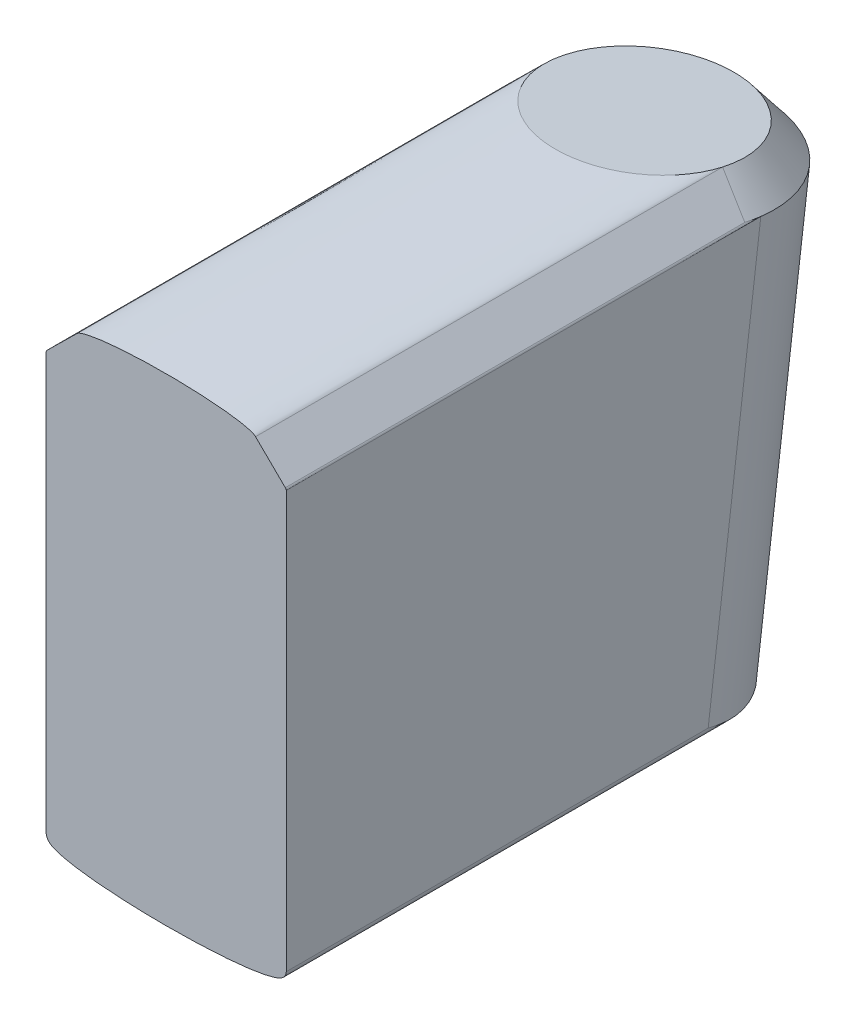
ISO-10303-21;
HEADER;
FILE_DESCRIPTION(('STEP AP214'),'2;1');
FILE_NAME('part.step','',(''),(''),'','','');
FILE_SCHEMA(('AUTOMOTIVE_DESIGN { 1 0 10303 214 1 1 1 1 }'));
ENDSEC;
DATA;
#1=APPLICATION_CONTEXT('core data for automotive mechanical design processes');
#2=APPLICATION_PROTOCOL_DEFINITION('international standard','automotive_design',2000,#1);
#3=PRODUCT_CONTEXT('',#1,'mechanical');
#4=PRODUCT('Part','Part','',(#3));
#5=PRODUCT_RELATED_PRODUCT_CATEGORY('part','',(#4));
#6=PRODUCT_DEFINITION_FORMATION('','',#4);
#7=PRODUCT_DEFINITION_CONTEXT('part definition',#1,'design');
#8=PRODUCT_DEFINITION('design','',#6,#7);
#9=PRODUCT_DEFINITION_SHAPE('','',#8);
#10=(LENGTH_UNIT() NAMED_UNIT(*) SI_UNIT(.MILLI.,.METRE.));
#11=(NAMED_UNIT(*) PLANE_ANGLE_UNIT() SI_UNIT($,.RADIAN.));
#12=(NAMED_UNIT(*) SI_UNIT($,.STERADIAN.) SOLID_ANGLE_UNIT());
#13=UNCERTAINTY_MEASURE_WITH_UNIT(LENGTH_MEASURE(1.E-05),#10,'distance_accuracy_value','');
#14=(GEOMETRIC_REPRESENTATION_CONTEXT(3) GLOBAL_UNCERTAINTY_ASSIGNED_CONTEXT((#13)) GLOBAL_UNIT_ASSIGNED_CONTEXT((#10,
#11,#12)) REPRESENTATION_CONTEXT('',''));
#15=CARTESIAN_POINT('',(0.,0.,0.));
#16=DIRECTION('',(0.,0.,1.));
#17=DIRECTION('',(1.,0.,0.));
#18=AXIS2_PLACEMENT_3D('',#15,#16,#17);
#19=CARTESIAN_POINT('',(0.,14.9408602598586,-0.939999251732284));
#20=DIRECTION('',(0.,-0.992114701314478,0.125333233564305));
#21=DIRECTION('',(0.,-0.125333233564305,-0.992114701314478));
#22=AXIS2_PLACEMENT_3D('',#19,#20,#21);
#23=CYLINDRICAL_SURFACE('',#22,4.);
#24=CARTESIAN_POINT('',(-4.,0.0591397401414062,0.939999251732286));
#25=CARTESIAN_POINT('',(-4.00000000000825,0.0591397430999098,0.939860596242548));
#26=CARTESIAN_POINT('',(-3.99999999259306,0.0591375188139687,0.939721942757717));
#27=CARTESIAN_POINT('',(-3.99999996306076,0.0591286613641135,0.939444194987688));
#28=CARTESIAN_POINT('',(-3.9999999408822,0.0591220097729296,0.93930510128862));
#29=CARTESIAN_POINT('',(-3.99999988181898,0.0591042986346159,0.939026473673091));
#30=CARTESIAN_POINT('',(-3.99999984485888,0.0590932164763934,0.938886941198471));
#31=CARTESIAN_POINT('',(-3.99999975620273,0.059066649380006,0.938607434794075));
#32=CARTESIAN_POINT('',(-3.99999970441786,0.0590511379039939,0.938467463391048));
#33=CARTESIAN_POINT('',(-3.99999958599731,0.0590157159310171,0.938187078138462));
#34=CARTESIAN_POINT('',(-3.99999951925964,0.0589957752362977,0.938046668110344));
#35=CARTESIAN_POINT('',(-3.99999937066474,0.0589514987839774,0.937765404075305));
#36=CARTESIAN_POINT('',(-3.99999928869196,0.0589271294749136,0.937624555356597));
#37=CARTESIAN_POINT('',(-3.99999910915338,0.0588739989587133,0.937342413131157));
#38=CARTESIAN_POINT('',(-3.99999901145735,0.0588452011670434,0.937201126527064));
#39=CARTESIAN_POINT('',(-3.99999879956971,0.0587832182387638,0.936918104330593));
#40=CARTESIAN_POINT('',(-3.99999868522952,0.0587499938390175,0.936776377330454));
#41=CARTESIAN_POINT('',(-3.99999856278132,0.0587147560962942,0.936635156614026));
#42=B_SPLINE_CURVE_WITH_KNOTS('',3,(#24,#25,#26,#27,#28,#29,#30,#31,#32,#33,#34,#35,#36,#37,#38,
#39,#40,#41),.UNSPECIFIED.,.F.,.F.,(4,2,2,2,2,2,2,2,4),(0.,0.000415945651314462,
0.000833633463143243,0.00125348069692003,0.00167589817400402,0.00210128920952744,
0.00253004865096333,0.00296256202986252,0.00339920483208718),.UNSPECIFIED.);
#43=CARTESIAN_POINT('',(-4.,0.0591397401414063,0.939999251732215));
#44=VERTEX_POINT('',#43);
#45=CARTESIAN_POINT('',(-3.99999856278132,0.0587147560960978,0.936635156614074));
#46=VERTEX_POINT('',#45);
#47=EDGE_CURVE('E146',#44,#46,#42,.T.);
#48=ORIENTED_EDGE('',*,*,#47,.F.);
#49=DIRECTION('',(0.,-0.992114701314478,0.125333233564305));
#50=VECTOR('',#49,1.);
#51=CARTESIAN_POINT('',(-4.,14.9408602598586,-0.939999251732284));
#52=LINE('',#51,#50);
#53=CARTESIAN_POINT('',(-4.,13.9487455585441,-0.814666018167979));
#54=VERTEX_POINT('',#53);
#55=EDGE_CURVE('E202',#44,#54,#52,.F.);
#56=ORIENTED_EDGE('',*,*,#55,.T.);
#57=CARTESIAN_POINT('',(0.,13.9487455585441,-0.814666018167979));
#58=DIRECTION('',(0.,0.992114701314478,-0.125333233564305));
#59=DIRECTION('',(0.,0.125333233564305,0.992114701314478));
#60=AXIS2_PLACEMENT_3D('',#57,#58,#59);
#61=CIRCLE('',#60,4.);
#62=CARTESIAN_POINT('',(4.,13.9487455585441,-0.814666018167979));
#63=VERTEX_POINT('',#62);
#64=EDGE_CURVE('E197',#54,#63,#61,.F.);
#65=ORIENTED_EDGE('',*,*,#64,.T.);
#66=DIRECTION('',(0.,-0.992114701314478,0.125333233564305));
#67=VECTOR('',#66,1.);
#68=CARTESIAN_POINT('',(4.,14.9408602598586,-0.939999251732284));
#69=LINE('',#68,#67);
#70=CARTESIAN_POINT('',(4.,0.0591397401414146,0.939999251732282));
#71=VERTEX_POINT('',#70);
#72=EDGE_CURVE('E256',#71,#63,#69,.F.);
#73=ORIENTED_EDGE('',*,*,#72,.F.);
#74=CARTESIAN_POINT('',(4.,0.0591397401414106,0.939999251732282));
#75=CARTESIAN_POINT('',(4.00000000052614,0.0574493710376827,0.933532475212381));
#76=CARTESIAN_POINT('',(3.99998352812304,0.0557599311507043,0.92706545876494));
#77=CARTESIAN_POINT('',(3.99982307097168,0.0475360087144437,0.895568575544385));
#78=CARTESIAN_POINT('',(3.99944879814329,0.0410133538635032,0.870536669655964));
#79=CARTESIAN_POINT('',(3.99758475570664,0.0214606857048467,0.79541898529505));
#80=CARTESIAN_POINT('',(3.99535329695771,0.00845427829959971,0.745343027018158));
#81=CARTESIAN_POINT('',(3.98891215633778,-0.0172698465098414,0.64522247054523));
#82=CARTESIAN_POINT('',(3.98470150043677,-0.0299874185342031,0.595177899952373));
#83=CARTESIAN_POINT('',(3.96893799476104,-0.0678653718903086,0.443634854323599));
#84=CARTESIAN_POINT('',(3.95429063994798,-0.0923408037096869,0.342264820651646));
#85=CARTESIAN_POINT('',(3.91684316374045,-0.138376779583303,0.140332389196036));
#86=CARTESIAN_POINT('',(3.89403958114724,-0.159936080779346,0.0397703528488622));
#87=CARTESIAN_POINT('',(3.8403309363762,-0.200046754655376,-0.159987646271619));
#88=CARTESIAN_POINT('',(3.80941078108406,-0.218592418221974,-0.259180697813031));
#89=CARTESIAN_POINT('',(3.73968462505683,-0.253360812371097,-0.45516141401432));
#90=CARTESIAN_POINT('',(3.70087883243313,-0.269583604237726,-0.55194914207792));
#91=CARTESIAN_POINT('',(3.61570797361971,-0.300364862811318,-0.742183997419191));
#92=CARTESIAN_POINT('',(3.56935795522298,-0.314926546405096,-0.83563733213761));
#93=CARTESIAN_POINT('',(3.46935883887931,-0.342793907712976,-1.01871802641852));
#94=CARTESIAN_POINT('',(3.41570987002849,-0.356099607634539,-1.10834545361279));
#95=CARTESIAN_POINT('',(3.24432522095679,-0.394431029410317,-1.37051950329388));
#96=CARTESIAN_POINT('',(3.11605684242431,-0.417903821940581,-1.53656973509146));
#97=CARTESIAN_POINT('',(2.82548410407335,-0.462555961308566,-1.85691803837732));
#98=CARTESIAN_POINT('',(2.66149130747752,-0.4834814412168,-2.00971557857123));
#99=CARTESIAN_POINT('',(2.30990712613313,-0.521025127838156,-2.28605175801779));
#100=CARTESIAN_POINT('',(2.12230615944858,-0.537641577199958,-2.40957845798226));
#101=CARTESIAN_POINT('',(1.72840767699828,-0.566366924401856,-2.62402071408217));
#102=CARTESIAN_POINT('',(1.52206398680873,-0.578464292896345,-2.7148528366799));
#103=CARTESIAN_POINT('',(1.09701031418649,-0.597860130993364,-2.86081214082672));
#104=CARTESIAN_POINT('',(0.878312847617423,-0.605163366183399,-2.91597477865474));
#105=CARTESIAN_POINT('',(0.54812878871375,-0.612380042057467,-2.97047358549793));
#106=CARTESIAN_POINT('',(0.438841768812338,-0.614162709575954,-2.98393347446619));
#107=CARTESIAN_POINT('',(0.219719718192596,-0.616536592236411,-3.00186780505245));
#108=CARTESIAN_POINT('',(0.109886042408707,-0.617129964341594,-3.00635851355444));
#109=CARTESIAN_POINT('',(7.50625114059792E-08,-0.617126991384775,-3.00636027564742));
#110=B_SPLINE_CURVE_WITH_KNOTS('',3,(#74,#75,#76,#77,#78,#79,#80,#81,#82,#83,#84,#85,#86,#87,
#88,#89,#90,#91,#92,#93,#94,#95,#96,#97,#98,#99,#100,#101,#102,#103,#104,#105,#106,#107,#108,
#109),.UNSPECIFIED.,.F.,.F.,(4,2,2,2,2,2,2,2,2,2,2,2,2,2,2,2,2,4),(0.,0.0200521374118743,
0.0976594987804293,0.252972733016871,0.408362482316098,0.723904953868143,1.03958148905357,
1.3558492486217,1.67210866258932,1.98774482314006,2.30337540177793,2.93394106455434,
3.60615352938385,4.27863971290818,4.95283005158742,5.62634919532298,5.95640899764163,
6.28586964402648),.UNSPECIFIED.);
#111=CARTESIAN_POINT('',(7.50625114059792E-08,-0.617126991384775,-3.00636027564742));
#112=VERTEX_POINT('',#111);
#113=EDGE_CURVE('E13',#71,#112,#110,.T.);
#114=ORIENTED_EDGE('',*,*,#113,.T.);
#115=CARTESIAN_POINT('',(7.50625121954951E-08,-0.617126991384775,-3.00636027564742));
#116=CARTESIAN_POINT('',(-0.112502354536988,-0.617127458304091,-3.00637241386565));
#117=CARTESIAN_POINT('',(-0.225003049181203,-0.616504148588256,-3.00165545295331));
#118=CARTESIAN_POINT('',(-0.449199520423445,-0.614017643155655,-2.98285044301219));
#119=CARTESIAN_POINT('',(-0.560895335378356,-0.612154506923655,-2.96876284357072));
#120=CARTESIAN_POINT('',(-0.782606685801108,-0.60719791146088,-2.93131798335424));
#121=CARTESIAN_POINT('',(-0.892623441636566,-0.604105394779809,-2.9079678240905));
#122=CARTESIAN_POINT('',(-1.11028152225831,-0.596706901118178,-2.85216843221766));
#123=CARTESIAN_POINT('',(-1.21792287601136,-0.592400938943772,-2.81971931063182));
#124=CARTESIAN_POINT('',(-1.43010129844194,-0.582594622287905,-2.74594063662903));
#125=CARTESIAN_POINT('',(-1.53463734602909,-0.577093879772899,-2.70460819918829));
#126=CARTESIAN_POINT('',(-1.73986126032217,-0.564922383916615,-2.61334905634981));
#127=CARTESIAN_POINT('',(-1.84054777521986,-0.558251224083215,-2.56341936519262));
#128=CARTESIAN_POINT('',(-2.03728222935225,-0.543771435644091,-2.45535281811393));
#129=CARTESIAN_POINT('',(-2.13333183633733,-0.535963220121712,-2.39721894294349));
#130=CARTESIAN_POINT('',(-2.32014870037699,-0.519236467791686,-2.27314717210535));
#131=CARTESIAN_POINT('',(-2.41091595825543,-0.510317931157211,-2.20720927765482));
#132=CARTESIAN_POINT('',(-2.58653153421978,-0.491395114442221,-2.06799634126872));
#133=CARTESIAN_POINT('',(-2.67137926527588,-0.48139072693036,-1.99472057339805));
#134=CARTESIAN_POINT('',(-2.83451404379775,-0.46031669694135,-1.84139256196989));
#135=CARTESIAN_POINT('',(-2.91280336286419,-0.449247426179705,-1.76134268419586));
#136=CARTESIAN_POINT('',(-3.0623476742428,-0.426028582227096,-1.59496920332066));
#137=CARTESIAN_POINT('',(-3.1335979336879,-0.413878292482405,-1.50864144595305));
#138=CARTESIAN_POINT('',(-3.26847166235237,-0.38846451870279,-1.33042602536174));
#139=CARTESIAN_POINT('',(-3.33209799400053,-0.375201455662294,-1.23854046845381));
#140=CARTESIAN_POINT('',(-3.45132582668123,-0.347431297080968,-1.04982715631966));
#141=CARTESIAN_POINT('',(-3.50692403397388,-0.332923694805877,-0.952997394538184));
#142=CARTESIAN_POINT('',(-3.609671719606,-0.302391853373769,-0.755168748280597));
#143=CARTESIAN_POINT('',(-3.65682034213388,-0.286367460840381,-0.654169442767733));
#144=CARTESIAN_POINT('',(-3.74228644246645,-0.252261389982194,-0.448932633719922));
#145=CARTESIAN_POINT('',(-3.78061097880755,-0.234181373402697,-0.344697794623607));
#146=CARTESIAN_POINT('',(-3.8481866715296,-0.194995351800946,-0.133906727588307));
#147=CARTESIAN_POINT('',(-3.87744120413931,-0.173890477043581,-0.0273513792841332));
#148=CARTESIAN_POINT('',(-3.91832013959133,-0.135910525811473,0.150611785797295));
#149=CARTESIAN_POINT('',(-3.93255659333683,-0.120038690070211,0.221645887068277));
#150=CARTESIAN_POINT('',(-3.95698309840348,-0.0869380588945589,0.364086536963375));
#151=CARTESIAN_POINT('',(-3.9671735322376,-0.0697093919203863,0.435493049732522));
#152=CARTESIAN_POINT('',(-3.98349718725059,-0.0342741787038903,0.578496394511027));
#153=CARTESIAN_POINT('',(-3.9896321919075,-0.0160680661319472,0.650093128938276));
#154=CARTESIAN_POINT('',(-3.99476949720659,0.00701171356078451,0.73963714727031));
#155=CARTESIAN_POINT('',(-3.99567044362449,0.0116441673399262,0.757549859073001));
#156=CARTESIAN_POINT('',(-3.99721930246681,0.0209264516168187,0.793381688218235));
#157=CARTESIAN_POINT('',(-3.99786722223262,0.0255762816064585,0.81130080535983));
#158=CARTESIAN_POINT('',(-3.99864924142953,0.0325838136359734,0.838176156207326));
#159=CARTESIAN_POINT('',(-3.99887827137278,0.0349251271860422,0.847134071463539));
#160=CARTESIAN_POINT('',(-3.99927309092776,0.0396112581828137,0.865050419676502));
#161=CARTESIAN_POINT('',(-3.99943888088453,0.0419560756103295,0.87400885263016));
#162=CARTESIAN_POINT('',(-3.99964015518001,0.0454643659957547,0.887449775457109));
#163=CARTESIAN_POINT('',(-3.99969934641032,0.0466323583733035,0.891930827206091));
#164=CARTESIAN_POINT('',(-3.99980192596806,0.0489535346755005,0.900897121663002));
#165=CARTESIAN_POINT('',(-3.99984531478178,0.050106719054779,0.905382364237708));
#166=CARTESIAN_POINT('',(-3.99991627144571,0.0524016641198939,0.914355455472441));
#167=CARTESIAN_POINT('',(-3.99994383673803,0.0535434229294714,0.918843304436489));
#168=CARTESIAN_POINT('',(-3.99997328166083,0.0552927803530263,0.925569236991057));
#169=CARTESIAN_POINT('',(-3.99998111284772,0.0558820350662995,0.927810298872267));
#170=CARTESIAN_POINT('',(-3.99998985772567,0.0569109350774877,0.931128533239139));
#171=CARTESIAN_POINT('',(-3.99999227258075,0.0572781739883659,0.932227636248346));
#172=CARTESIAN_POINT('',(-3.99999516899759,0.0578482094812609,0.933870095718069));
#173=CARTESIAN_POINT('',(-3.99999601367147,0.0580414930708301,0.934416752162905));
#174=CARTESIAN_POINT('',(-3.99999746527062,0.0584038799181685,0.935517722474144));
#175=CARTESIAN_POINT('',(-3.99999807221753,0.0585729853764777,0.936072035638638));
#176=CARTESIAN_POINT('',(-3.99999856278121,0.0587147560651597,0.936635156489073));
#177=B_SPLINE_CURVE_WITH_KNOTS('',3,(#115,#116,#117,#118,#119,#120,#121,#122,#123,#124,#125,
#126,#127,#128,#129,#130,#131,#132,#133,#134,#135,#136,#137,#138,#139,#140,#141,#142,#143,#144,
#145,#146,#147,#148,#149,#150,#151,#152,#153,#154,#155,#156,#157,#158,#159,#160,#161,#162,#163,
#164,#165,#166,#167,#168,#169,#170,#171,#172,#173,#174,#175,#176),.UNSPECIFIED.,.F.,.F.,(4,2,2,
2,2,2,2,2,2,2,2,2,2,2,2,2,2,2,2,2,2,2,2,2,2,2,2,2,2,2,4),(0.,0.337404275684945,
0.674792364454142,1.01192227958403,1.34904808131864,1.68628353688781,2.02363634880986,
2.36086690746538,2.69809741352457,3.03536131478563,3.37250791262744,3.70987967727559,
4.04712437502801,4.38450704513974,4.72192386758234,5.05906983954106,5.39609016079124,
5.61846869641251,5.84082620323423,6.06308585751945,6.11865698732743,6.17422650465895,
6.20201138194321,6.22979610763427,6.24368970144979,6.25758286768407,6.27147827914262,
6.27842634402778,6.28190199818807,6.28364112132356,6.28538008607421),.UNSPECIFIED.);
#178=EDGE_CURVE('E150',#112,#46,#177,.T.);
#179=ORIENTED_EDGE('',*,*,#178,.T.);
#180=EDGE_LOOP('',(#48,#56,#65,#73,#114,#179));
#181=FACE_BOUND('',#180,.T.);
#182=ADVANCED_FACE('F70',(#181),#23,.T.);
#183=CARTESIAN_POINT('',(0.,14.9408602598586,-0.939999251732284));
#184=DIRECTION('',(0.,-0.992114701314478,0.125333233564305));
#185=DIRECTION('',(0.,-0.125333233564305,-0.992114701314478));
#186=AXIS2_PLACEMENT_3D('',#183,#184,#185);
#187=CONICAL_SURFACE('',#186,3.,0.785398163397447);
#188=CARTESIAN_POINT('',(0.,14.9408602598586,-0.939999251732284));
#189=DIRECTION('',(0.,0.992114701314478,-0.125333233564305));
#190=DIRECTION('',(0.,0.125333233564305,0.992114701314478));
#191=AXIS2_PLACEMENT_3D('',#188,#189,#190);
#192=CIRCLE('',#191,3.);
#193=CARTESIAN_POINT('',(2.975965052428,14.988360068343,-0.563999551039372));
#194=VERTEX_POINT('',#193);
#195=CARTESIAN_POINT('',(-2.975965052428,14.988360068343,-0.563999551039372));
#196=VERTEX_POINT('',#195);
#197=EDGE_CURVE('E191',#194,#196,#192,.T.);
#198=ORIENTED_EDGE('',*,*,#197,.F.);
#199=DIRECTION('',(0.701441689715338,-0.690335220786194,0.177247958722714));
#200=VECTOR('',#199,1.);
#201=CARTESIAN_POINT('',(1.487982526214,16.4527822160725,-0.939999251732284));
#202=LINE('',#201,#200);
#203=CARTESIAN_POINT('',(3.96795340323733,14.0120786365234,-0.313333083910762));
#204=VERTEX_POINT('',#203);
#205=EDGE_CURVE('E225',#194,#204,#202,.T.);
#206=ORIENTED_EDGE('',*,*,#205,.T.);
#207=CARTESIAN_POINT('',(3.96795340323733,14.0120786365234,-0.313333083910763));
#208=CARTESIAN_POINT('',(3.97324653408693,14.0068711696821,-0.354554428501235));
#209=CARTESIAN_POINT('',(3.97788595149723,14.0016515943264,-0.395871621856894));
#210=CARTESIAN_POINT('',(3.99353934650832,13.9811103116286,-0.558472617381197));
#211=CARTESIAN_POINT('',(3.999588218342,13.9657222520896,-0.680281651285993));
#212=CARTESIAN_POINT('',(3.99999324288926,13.9498107198492,-0.806234398240001));
#213=CARTESIAN_POINT('',(4.00000001483515,13.9492781319746,-0.810450265372782));
#214=CARTESIAN_POINT('',(4.,13.9487455585441,-0.814666018167979));
#215=B_SPLINE_CURVE_WITH_KNOTS('',3,(#207,#208,#209,#210,#211,#212,#213,#214),.UNSPECIFIED.,.F.,
.F.,(4,2,2,4),(0.,0.125682866673564,0.493788023832498,0.506536136267799),.UNSPECIFIED.);
#216=EDGE_CURVE('E98',#63,#204,#215,.F.);
#217=ORIENTED_EDGE('',*,*,#216,.F.);
#218=ORIENTED_EDGE('',*,*,#64,.F.);
#219=CARTESIAN_POINT('',(-3.96795340323733,14.0120786365234,-0.313333083910763));
#220=VERTEX_POINT('',#219);
#221=EDGE_CURVE('E84',#220,#54,#61,.F.);
#222=ORIENTED_EDGE('',*,*,#221,.F.);
#223=DIRECTION('',(-0.701441689715338,-0.690335220786194,0.177247958722714));
#224=VECTOR('',#223,1.);
#225=CARTESIAN_POINT('',(-1.487982526214,16.4527822160725,-0.939999251732284));
#226=LINE('',#225,#224);
#227=EDGE_CURVE('E159',#196,#220,#226,.T.);
#228=ORIENTED_EDGE('',*,*,#227,.F.);
#229=EDGE_LOOP('',(#198,#206,#217,#218,#222,#228));
#230=FACE_BOUND('',#229,.T.);
#231=ADVANCED_FACE('F67',(#230),#187,.T.);
#232=CARTESIAN_POINT('',(0.,14.9408602598586,-0.939999251732284));
#233=DIRECTION('',(0.,0.992114701314478,-0.125333233564305));
#234=DIRECTION('',(0.,0.125333233564305,0.992114701314478));
#235=AXIS2_PLACEMENT_3D('',#232,#233,#234);
#236=PLANE('',#235);
#237=ORIENTED_EDGE('',*,*,#197,.T.);
#238=CARTESIAN_POINT('',(-2.975965052428,14.988360068343,-0.563999551039372));
#239=CARTESIAN_POINT('',(-2.97540791369451,14.9889083789404,-0.559659225538206));
#240=CARTESIAN_POINT('',(-2.97484113903813,14.9894565322319,-0.555320145279908));
#241=CARTESIAN_POINT('',(-2.97015800249941,14.9939087912913,-0.520076884801147));
#242=CARTESIAN_POINT('',(-2.96556220232827,14.9978049032464,-0.489235983825448));
#243=CARTESIAN_POINT('',(-2.94010188661032,15.0172676353306,-0.335172598433996));
#244=CARTESIAN_POINT('',(-2.91187798660738,15.032693267949,-0.213066141386499));
#245=CARTESIAN_POINT('',(-2.82871359262177,15.0678124519959,0.0649308272060057));
#246=CARTESIAN_POINT('',(-2.76812317640597,15.0872981120694,0.219175708545081));
#247=CARTESIAN_POINT('',(-2.62205383696627,15.1247412718287,0.515568837025909));
#248=CARTESIAN_POINT('',(-2.53657491374238,15.1426987715144,0.657717084167663));
#249=CARTESIAN_POINT('',(-2.34308115144237,15.1765937355366,0.926023351925183));
#250=CARTESIAN_POINT('',(-2.23506631236625,15.1925311998732,1.05218137254095));
#251=CARTESIAN_POINT('',(-1.99948126309072,15.2219456006355,1.28502032987381));
#252=CARTESIAN_POINT('',(-1.87191105289132,15.2354225370614,1.3917012665909));
#253=CARTESIAN_POINT('',(-1.60073345959277,15.2595444151224,1.58264559291378));
#254=CARTESIAN_POINT('',(-1.45712607649363,15.2701893567575,1.66690898251957));
#255=CARTESIAN_POINT('',(-1.15783512102128,15.2883535776187,1.81069359607735));
#256=CARTESIAN_POINT('',(-1.00215154864807,15.2958728568448,1.87021482002934));
#257=CARTESIAN_POINT('',(-0.683002152583354,15.307578378307,1.9628735634372));
#258=CARTESIAN_POINT('',(-0.519536328891843,15.3117646205431,1.99601108289307));
#259=CARTESIAN_POINT('',(-0.189331048299281,15.3166886020402,2.03498840992219));
#260=CARTESIAN_POINT('',(-0.0225915913982294,15.3174263413012,2.04082821749545));
#261=CARTESIAN_POINT('',(0.309562063252401,15.3154329666002,2.02504903196068));
#262=CARTESIAN_POINT('',(0.474976261001979,15.3127018526383,2.00343003885267));
#263=CARTESIAN_POINT('',(0.799917024537295,15.3038461126504,1.93332963863903));
#264=CARTESIAN_POINT('',(0.959443590323031,15.2977214866246,1.8848482315334));
#265=CARTESIAN_POINT('',(1.26820922060094,15.282247597103,1.76235978338362));
#266=CARTESIAN_POINT('',(1.41744828509312,15.2728983336073,1.68835274233946));
#267=CARTESIAN_POINT('',(1.70152236122296,15.2512332248436,1.51685574749838));
#268=CARTESIAN_POINT('',(1.83635737286062,15.2389173795757,1.41936579370145));
#269=CARTESIAN_POINT('',(2.08790566241927,15.2116580846652,1.20358625575223));
#270=CARTESIAN_POINT('',(2.20461894034025,15.1967146350226,1.08529667159995));
#271=CARTESIAN_POINT('',(2.41669997968667,15.164614943053,0.831201445576906));
#272=CARTESIAN_POINT('',(2.5120677411121,15.147458700726,0.695395803706139));
#273=CARTESIAN_POINT('',(2.67884481144337,15.1113967219778,0.409935848217693));
#274=CARTESIAN_POINT('',(2.75025412034921,15.0924909855567,0.260281534600012));
#275=CARTESIAN_POINT('',(2.8484800354153,15.0596979319611,0.000697786155528653));
#276=CARTESIAN_POINT('',(2.88225557031454,15.0461295051105,-0.106707371833154));
#277=CARTESIAN_POINT('',(2.9377349115388,15.0184105917191,-0.32612516468753));
#278=CARTESIAN_POINT('',(2.95927466794459,15.0042548066807,-0.438179741480031));
#279=CARTESIAN_POINT('',(2.9748411933136,14.9894565103752,-0.555320318657715));
#280=CARTESIAN_POINT('',(2.97540797083578,14.9889083560614,-0.55965940684528));
#281=CARTESIAN_POINT('',(2.975965052428,14.988360068343,-0.563999551039372));
#282=B_SPLINE_CURVE_WITH_KNOTS('',3,(#238,#239,#240,#241,#242,#243,#244,#245,#246,#247,#248,
#249,#250,#251,#252,#253,#254,#255,#256,#257,#258,#259,#260,#261,#262,#263,#264,#265,#266,#267,
#268,#269,#270,#271,#272,#273,#274,#275,#276,#277,#278,#279,#280,#281),.UNSPECIFIED.,.F.,.F.,(4,
2,2,2,2,2,2,2,2,2,2,2,2,2,2,2,2,2,2,2,2,4),(0.,0.0132303894385123,0.107492539437742,
0.485244011614079,0.983473098753545,1.48170218589301,1.97993127303248,2.47816036017194,
2.97638944731141,3.47461853445087,3.97284762159034,4.4710767087298,4.96930579586927,
5.46753488300874,5.9657639701482,6.46399305728767,6.96222214442713,7.4604512315666,
7.95868031870606,8.29826484288024,8.64230091356254,8.65553130299343),.UNSPECIFIED.);
#283=EDGE_CURVE('E298',#196,#194,#282,.T.);
#284=ORIENTED_EDGE('',*,*,#283,.T.);
#285=EDGE_LOOP('',(#237,#284));
#286=FACE_BOUND('',#285,.T.);
#287=ADVANCED_FACE('F179',(#286),#236,.T.);
#288=CARTESIAN_POINT('',(-4.,0.0591397401414062,-4.78412482342589));
#289=CARTESIAN_POINT('',(-3.99999685604576,0.058196816377075,-4.78412482342589));
#290=CARTESIAN_POINT('',(-3.99998610303542,0.0549718111116148,-4.78412482342589));
#291=CARTESIAN_POINT('',(-3.99973454507591,0.0449010406887746,-4.78412482342589));
#292=CARTESIAN_POINT('',(-3.99816180405238,0.0243633561155787,-4.78412482342589));
#293=CARTESIAN_POINT('',(-3.99319020410983,-0.00255589496907249,-4.78412482342589));
#294=CARTESIAN_POINT('',(-3.98462131469703,-0.0305330009618844,-4.78412482342589));
#295=CARTESIAN_POINT('',(-3.97423129418257,-0.0553554984586757,-4.78412482342589));
#296=CARTESIAN_POINT('',(-3.96152555686704,-0.0790609459328335,-4.78412482342589));
#297=CARTESIAN_POINT('',(-3.946568985523,-0.101705442989336,-4.78412482342589));
#298=CARTESIAN_POINT('',(-3.92929097098514,-0.123447997896714,-4.78412482342589));
#299=CARTESIAN_POINT('',(-3.90943108303251,-0.144536292585582,-4.78412482342589));
#300=CARTESIAN_POINT('',(-3.88648993761167,-0.165278460635859,-4.78412482342589));
#301=CARTESIAN_POINT('',(-3.85975236981416,-0.185960328253831,-4.78412482342589));
#302=CARTESIAN_POINT('',(-3.82857220352419,-0.20664271348273,-4.78412482342589));
#303=CARTESIAN_POINT('',(-3.79291511948639,-0.22699562729101,-4.78412482342589));
#304=CARTESIAN_POINT('',(-3.75031328019319,-0.248098091214254,-4.78412482342589));
#305=CARTESIAN_POINT('',(-3.70138759702322,-0.269079557333219,-4.78412482342589));
#306=CARTESIAN_POINT('',(-3.64264255840137,-0.291016489405679,-4.78412482342589));
#307=CARTESIAN_POINT('',(-3.57333408062744,-0.313674509149268,-4.78412482342589));
#308=CARTESIAN_POINT('',(-3.48722655840175,-0.338196072445326,-4.78412482342589));
#309=CARTESIAN_POINT('',(-3.37700425972557,-0.365438587346036,-4.78412482342589));
#310=CARTESIAN_POINT('',(-3.23768809452666,-0.394980167887198,-4.78412482342589));
#311=CARTESIAN_POINT('',(-3.0636836995915,-0.426310807268639,-4.78412482342589));
#312=CARTESIAN_POINT('',(-2.85586289939542,-0.457952407106807,-4.78412482342589));
#313=CARTESIAN_POINT('',(-2.6104492876025,-0.489305023667279,-4.78412482342589));
#314=CARTESIAN_POINT('',(-2.32421708825665,-0.519598415424706,-4.78412482342589));
#315=CARTESIAN_POINT('',(-1.99477400587158,-0.547899211619686,-4.78412482342589));
#316=CARTESIAN_POINT('',(-1.62088385052683,-0.573120734551276,-4.78412482342589));
#317=CARTESIAN_POINT('',(-1.19462899458472,-0.594450815367913,-4.78412482342589));
#318=CARTESIAN_POINT('',(-0.691394041194893,-0.610941394795187,-4.78412482342589));
#319=CARTESIAN_POINT('',(-0.305775257167266,-0.616327568471037,-4.78412482342589));
#320=CARTESIAN_POINT('',(-0.0685616282952263,-0.617065299241857,-4.78412482342589));
#321=CARTESIAN_POINT('',(-0.0281344978611519,-0.617122625336799,-4.78412482342589));
#322=CARTESIAN_POINT('',(-0.00528016102399422,-0.617126171974289,-4.78412482342589));
#323=CARTESIAN_POINT('',(7.50625121954951E-08,-0.617126991384775,-4.78412482342589));
#324=B_SPLINE_CURVE_WITH_KNOTS('',3,(#288,#289,#290,#291,#292,#293,#294,#295,#296,#297,#298,
#299,#300,#301,#302,#303,#304,#305,#306,#307,#308,#309,#310,#311,#312,#313,#314,#315,#316,#317,
#318,#319,#320,#321,#322,#323),.UNSPECIFIED.,.F.,.F.,(4,1,1,1,1,1,1,1,1,1,1,1,1,1,1,1,1,1,1,1,1,
1,1,1,1,1,1,1,1,1,1,1,1,4),(6.05707965843676E-07,0.000964949671805722,0.00330033868081057,
0.010309808601119,0.0220737438720209,0.0316532765388764,0.0414938541646205,0.0517264788465042,
0.062518144370361,0.0740835486620359,0.0867007768661076,0.100727169541855,0.116587471829371,
0.134623839897152,0.15462804726221,0.175530141334581,0.201320561658199,0.226237672387834,
0.255154057243509,0.287938156570628,0.324585102325779,0.369618802742334,0.418538748243734,
0.471450041494719,0.528432616871224,0.58954693311502,0.654839066784012,0.724344863977579,
0.798093293204985,0.880442077787446,0.980072752883531,0.988735084958806,0.99739736876481,1.),.UNSPECIFIED.);
#325=DIRECTION('',(0.,0.,1.));
#326=VECTOR('',#325,1.);
#327=SURFACE_OF_LINEAR_EXTRUSION('',#324,#326);
#328=ORIENTED_EDGE('',*,*,#178,.F.);
#329=DIRECTION('',(0.,0.,1.));
#330=VECTOR('',#329,1.);
#331=CARTESIAN_POINT('',(7.50625121954951E-08,-0.617126991384775,-4.78412482342589));
#332=LINE('',#331,#330);
#333=CARTESIAN_POINT('',(7.50625121954951E-08,-0.617126991384775,15.));
#334=VERTEX_POINT('',#333);
#335=EDGE_CURVE('E257',#112,#334,#332,.T.);
#336=ORIENTED_EDGE('',*,*,#335,.T.);
#337=CARTESIAN_POINT('',(-4.,0.0591397401414062,15.));
#338=CARTESIAN_POINT('',(-3.99999685604576,0.058196816377075,15.));
#339=CARTESIAN_POINT('',(-3.99998610303542,0.0549718111116148,15.));
#340=CARTESIAN_POINT('',(-3.99973454507591,0.0449010406887746,15.));
#341=CARTESIAN_POINT('',(-3.99816180405238,0.0243633561155787,15.));
#342=CARTESIAN_POINT('',(-3.99319020410983,-0.00255589496907249,15.));
#343=CARTESIAN_POINT('',(-3.98462131469703,-0.0305330009618844,15.));
#344=CARTESIAN_POINT('',(-3.97423129418257,-0.0553554984586757,15.));
#345=CARTESIAN_POINT('',(-3.96152555686704,-0.0790609459328335,15.));
#346=CARTESIAN_POINT('',(-3.946568985523,-0.101705442989336,15.));
#347=CARTESIAN_POINT('',(-3.92929097098514,-0.123447997896714,15.));
#348=CARTESIAN_POINT('',(-3.90943108303251,-0.144536292585582,15.));
#349=CARTESIAN_POINT('',(-3.88648993761167,-0.165278460635859,15.));
#350=CARTESIAN_POINT('',(-3.85975236981416,-0.185960328253831,15.));
#351=CARTESIAN_POINT('',(-3.82857220352419,-0.20664271348273,15.));
#352=CARTESIAN_POINT('',(-3.79291511948639,-0.22699562729101,15.));
#353=CARTESIAN_POINT('',(-3.75031328019319,-0.248098091214254,15.));
#354=CARTESIAN_POINT('',(-3.70138759702322,-0.269079557333219,15.));
#355=CARTESIAN_POINT('',(-3.64264255840137,-0.291016489405679,15.));
#356=CARTESIAN_POINT('',(-3.57333408062744,-0.313674509149268,15.));
#357=CARTESIAN_POINT('',(-3.48722655840175,-0.338196072445326,15.));
#358=CARTESIAN_POINT('',(-3.37700425972557,-0.365438587346036,15.));
#359=CARTESIAN_POINT('',(-3.23768809452666,-0.394980167887198,15.));
#360=CARTESIAN_POINT('',(-3.0636836995915,-0.426310807268639,15.));
#361=CARTESIAN_POINT('',(-2.85586289939542,-0.457952407106807,15.));
#362=CARTESIAN_POINT('',(-2.6104492876025,-0.489305023667279,15.));
#363=CARTESIAN_POINT('',(-2.32421708825665,-0.519598415424706,15.));
#364=CARTESIAN_POINT('',(-1.99477400587158,-0.547899211619686,15.));
#365=CARTESIAN_POINT('',(-1.62088385052683,-0.573120734551276,15.));
#366=CARTESIAN_POINT('',(-1.19462899458472,-0.594450815367913,15.));
#367=CARTESIAN_POINT('',(-0.691394041194893,-0.610941394795187,15.));
#368=CARTESIAN_POINT('',(-0.305775257167266,-0.616327568471037,15.));
#369=CARTESIAN_POINT('',(-0.0685616282952263,-0.617065299241857,15.));
#370=CARTESIAN_POINT('',(-0.0281344978611519,-0.617122625336799,15.));
#371=CARTESIAN_POINT('',(-0.00528016102399422,-0.617126171974289,15.));
#372=CARTESIAN_POINT('',(7.50625121954951E-08,-0.617126991384775,15.));
#373=B_SPLINE_CURVE_WITH_KNOTS('',3,(#337,#338,#339,#340,#341,#342,#343,#344,#345,#346,#347,
#348,#349,#350,#351,#352,#353,#354,#355,#356,#357,#358,#359,#360,#361,#362,#363,#364,#365,#366,
#367,#368,#369,#370,#371,#372),.UNSPECIFIED.,.F.,.F.,(4,1,1,1,1,1,1,1,1,1,1,1,1,1,1,1,1,1,1,1,1,
1,1,1,1,1,1,1,1,1,1,1,1,4),(6.05707965843676E-07,0.000964949671805722,0.00330033868081057,
0.010309808601119,0.0220737438720209,0.0316532765388764,0.0414938541646205,0.0517264788465042,
0.062518144370361,0.0740835486620359,0.0867007768661076,0.100727169541855,0.116587471829371,
0.134623839897152,0.15462804726221,0.175530141334581,0.201320561658199,0.226237672387834,
0.255154057243509,0.287938156570628,0.324585102325779,0.369618802742334,0.418538748243734,
0.471450041494719,0.528432616871224,0.58954693311502,0.654839066784012,0.724344863977579,
0.798093293204985,0.880442077787446,0.980072752883531,0.988735084958806,0.99739736876481,1.),.UNSPECIFIED.);
#374=CARTESIAN_POINT('',(-4.,0.0591397401414062,15.));
#375=VERTEX_POINT('',#374);
#376=EDGE_CURVE('E201',#375,#334,#373,.T.);
#377=ORIENTED_EDGE('',*,*,#376,.F.);
#378=DIRECTION('',(0.,0.,1.));
#379=VECTOR('',#378,1.);
#380=CARTESIAN_POINT('',(-4.,0.0591397401414062,-4.78412482342589));
#381=LINE('',#380,#379);
#382=EDGE_CURVE('E160',#44,#375,#381,.T.);
#383=ORIENTED_EDGE('',*,*,#382,.F.);
#384=ORIENTED_EDGE('',*,*,#47,.T.);
#385=EDGE_LOOP('',(#328,#336,#377,#383,#384));
#386=FACE_BOUND('',#385,.T.);
#387=ADVANCED_FACE('F152',(#386),#327,.T.);
#388=CARTESIAN_POINT('',(0.,13.9487455585441,-4.78412482342589));
#389=DIRECTION('',(0.,0.,1.));
#390=DIRECTION('',(-1.,0.,0.));
#391=AXIS2_PLACEMENT_3D('',#388,#389,#390);
#392=ELLIPSE('',#391,4.,0.501332934257219);
#393=DIRECTION('',(0.,0.,1.));
#394=VECTOR('',#393,1.);
#395=SURFACE_OF_LINEAR_EXTRUSION('',#392,#394);
#396=DIRECTION('',(0.,0.,1.));
#397=VECTOR('',#396,1.);
#398=CARTESIAN_POINT('',(-3.96795340323733,14.0120786365234,-4.78412482342589));
#399=LINE('',#398,#397);
#400=CARTESIAN_POINT('',(-3.96795340323733,14.0120786365234,15.));
#401=VERTEX_POINT('',#400);
#402=EDGE_CURVE('E253',#220,#401,#399,.T.);
#403=ORIENTED_EDGE('',*,*,#402,.F.);
#404=ORIENTED_EDGE('',*,*,#221,.T.);
#405=DIRECTION('',(0.,0.,1.));
#406=VECTOR('',#405,1.);
#407=CARTESIAN_POINT('',(-4.,13.9487455585441,-4.78412482342589));
#408=LINE('',#407,#406);
#409=CARTESIAN_POINT('',(-4.,13.9487455585441,15.));
#410=VERTEX_POINT('',#409);
#411=EDGE_CURVE('E249',#54,#410,#408,.T.);
#412=ORIENTED_EDGE('',*,*,#411,.T.);
#413=CARTESIAN_POINT('',(0.,13.9487455585441,15.));
#414=DIRECTION('',(0.,0.,1.));
#415=DIRECTION('',(-1.,0.,0.));
#416=AXIS2_PLACEMENT_3D('',#413,#414,#415);
#417=ELLIPSE('',#416,4.,0.501332934257219);
#418=EDGE_CURVE('E214',#401,#410,#417,.T.);
#419=ORIENTED_EDGE('',*,*,#418,.F.);
#420=EDGE_LOOP('',(#403,#404,#412,#419));
#421=FACE_BOUND('',#420,.T.);
#422=ADVANCED_FACE('F177',(#421),#395,.T.);
#423=CARTESIAN_POINT('',(-8.95746126149174,9.10157351621846,-4.78412482342589));
#424=DIRECTION('',(-0.70144168971534,0.712726845242473,0.));
#425=DIRECTION('',(-0.712726845242473,-0.70144168971534,0.));
#426=AXIS2_PLACEMENT_3D('',#423,#424,#425);
#427=PLANE('',#426);
#428=DIRECTION('',(0.,0.,1.));
#429=VECTOR('',#428,1.);
#430=CARTESIAN_POINT('',(-2.975965052428,14.988360068343,-4.78412482342589));
#431=LINE('',#430,#429);
#432=CARTESIAN_POINT('',(-2.975965052428,14.988360068343,15.));
#433=VERTEX_POINT('',#432);
#434=EDGE_CURVE('E331',#196,#433,#431,.T.);
#435=ORIENTED_EDGE('',*,*,#434,.F.);
#436=ORIENTED_EDGE('',*,*,#227,.T.);
#437=ORIENTED_EDGE('',*,*,#402,.T.);
#438=DIRECTION('',(-0.712726845242473,-0.70144168971534,0.));
#439=VECTOR('',#438,1.);
#440=CARTESIAN_POINT('',(-8.95746126149174,9.10157351621846,15.));
#441=LINE('',#440,#439);
#442=EDGE_CURVE('E219',#433,#401,#441,.T.);
#443=ORIENTED_EDGE('',*,*,#442,.F.);
#444=EDGE_LOOP('',(#435,#436,#437,#443));
#445=FACE_BOUND('',#444,.T.);
#446=ADVANCED_FACE('F291',(#445),#427,.T.);
#447=CARTESIAN_POINT('',(0.,14.9408602598586,-4.78412482342589));
#448=DIRECTION('',(0.,0.,1.));
#449=DIRECTION('',(1.,0.,0.));
#450=AXIS2_PLACEMENT_3D('',#447,#448,#449);
#451=ELLIPSE('',#450,3.,0.375999700692914);
#452=DIRECTION('',(0.,0.,1.));
#453=VECTOR('',#452,1.);
#454=SURFACE_OF_LINEAR_EXTRUSION('',#451,#453);
#455=DIRECTION('',(0.,0.,1.));
#456=VECTOR('',#455,1.);
#457=CARTESIAN_POINT('',(2.975965052428,14.988360068343,-4.78412482342589));
#458=LINE('',#457,#456);
#459=CARTESIAN_POINT('',(2.975965052428,14.988360068343,15.));
#460=VERTEX_POINT('',#459);
#461=EDGE_CURVE('E270',#194,#460,#458,.T.);
#462=ORIENTED_EDGE('',*,*,#461,.F.);
#463=ORIENTED_EDGE('',*,*,#283,.F.);
#464=ORIENTED_EDGE('',*,*,#434,.T.);
#465=CARTESIAN_POINT('',(0.,14.9408602598586,15.));
#466=DIRECTION('',(0.,0.,1.));
#467=DIRECTION('',(1.,0.,0.));
#468=AXIS2_PLACEMENT_3D('',#465,#466,#467);
#469=ELLIPSE('',#468,3.,0.375999700692914);
#470=EDGE_CURVE('E227',#460,#433,#469,.T.);
#471=ORIENTED_EDGE('',*,*,#470,.F.);
#472=EDGE_LOOP('',(#462,#463,#464,#471));
#473=FACE_BOUND('',#472,.T.);
#474=ADVANCED_FACE('F289',(#473),#454,.T.);
#475=CARTESIAN_POINT('',(8.95746126149174,9.10157351621846,-4.78412482342589));
#476=DIRECTION('',(0.70144168971534,0.712726845242473,0.));
#477=DIRECTION('',(-0.712726845242473,0.70144168971534,0.));
#478=AXIS2_PLACEMENT_3D('',#475,#476,#477);
#479=PLANE('',#478);
#480=DIRECTION('',(0.,0.,1.));
#481=VECTOR('',#480,1.);
#482=CARTESIAN_POINT('',(3.96795340323733,14.0120786365234,-4.78412482342589));
#483=LINE('',#482,#481);
#484=CARTESIAN_POINT('',(3.96795340323733,14.0120786365234,15.));
#485=VERTEX_POINT('',#484);
#486=EDGE_CURVE('E267',#204,#485,#483,.T.);
#487=ORIENTED_EDGE('',*,*,#486,.F.);
#488=ORIENTED_EDGE('',*,*,#205,.F.);
#489=ORIENTED_EDGE('',*,*,#461,.T.);
#490=DIRECTION('',(-0.712726845242473,0.70144168971534,0.));
#491=VECTOR('',#490,1.);
#492=CARTESIAN_POINT('',(8.95746126149174,9.10157351621846,15.));
#493=LINE('',#492,#491);
#494=EDGE_CURVE('E229',#485,#460,#493,.T.);
#495=ORIENTED_EDGE('',*,*,#494,.F.);
#496=EDGE_LOOP('',(#487,#488,#489,#495));
#497=FACE_BOUND('',#496,.T.);
#498=ADVANCED_FACE('F279',(#497),#479,.T.);
#499=CARTESIAN_POINT('',(0.,13.9487455585441,-4.78412482342589));
#500=DIRECTION('',(0.,0.,1.));
#501=DIRECTION('',(-1.,0.,0.));
#502=AXIS2_PLACEMENT_3D('',#499,#500,#501);
#503=ELLIPSE('',#502,4.,0.501332934257219);
#504=DIRECTION('',(0.,0.,1.));
#505=VECTOR('',#504,1.);
#506=SURFACE_OF_LINEAR_EXTRUSION('',#503,#505);
#507=DIRECTION('',(0.,0.,1.));
#508=VECTOR('',#507,1.);
#509=CARTESIAN_POINT('',(4.,13.9487455585441,-4.78412482342589));
#510=LINE('',#509,#508);
#511=CARTESIAN_POINT('',(4.,13.9487455585441,15.));
#512=VERTEX_POINT('',#511);
#513=EDGE_CURVE('E260',#63,#512,#510,.T.);
#514=ORIENTED_EDGE('',*,*,#513,.F.);
#515=ORIENTED_EDGE('',*,*,#216,.T.);
#516=ORIENTED_EDGE('',*,*,#486,.T.);
#517=CARTESIAN_POINT('',(0.,13.9487455585441,15.));
#518=DIRECTION('',(0.,0.,1.));
#519=DIRECTION('',(-1.,0.,0.));
#520=AXIS2_PLACEMENT_3D('',#517,#518,#519);
#521=ELLIPSE('',#520,4.,0.501332934257219);
#522=EDGE_CURVE('E231',#512,#485,#521,.T.);
#523=ORIENTED_EDGE('',*,*,#522,.F.);
#524=EDGE_LOOP('',(#514,#515,#516,#523));
#525=FACE_BOUND('',#524,.T.);
#526=ADVANCED_FACE('F272',(#525),#506,.T.);
#527=CARTESIAN_POINT('',(4.,0.,-4.78412482342589));
#528=DIRECTION('',(1.,0.,0.));
#529=DIRECTION('',(0.,0.,-1.));
#530=AXIS2_PLACEMENT_3D('',#527,#528,#529);
#531=PLANE('',#530);
#532=DIRECTION('',(0.,0.,1.));
#533=VECTOR('',#532,1.);
#534=CARTESIAN_POINT('',(4.,0.0591397401414062,-4.78412482342589));
#535=LINE('',#534,#533);
#536=CARTESIAN_POINT('',(4.,0.0591397401414062,15.));
#537=VERTEX_POINT('',#536);
#538=EDGE_CURVE('E207',#71,#537,#535,.T.);
#539=ORIENTED_EDGE('',*,*,#538,.F.);
#540=ORIENTED_EDGE('',*,*,#72,.T.);
#541=ORIENTED_EDGE('',*,*,#513,.T.);
#542=DIRECTION('',(0.,1.,0.));
#543=VECTOR('',#542,1.);
#544=CARTESIAN_POINT('',(4.,0.,15.));
#545=LINE('',#544,#543);
#546=EDGE_CURVE('E236',#537,#512,#545,.T.);
#547=ORIENTED_EDGE('',*,*,#546,.F.);
#548=EDGE_LOOP('',(#539,#540,#541,#547));
#549=FACE_BOUND('',#548,.T.);
#550=ADVANCED_FACE('F280',(#549),#531,.T.);
#551=CARTESIAN_POINT('',(7.50625114059792E-08,-0.617126991384775,-4.78412482342589));
#552=CARTESIAN_POINT('',(0.0661346374624348,-0.617117910402282,-4.78412482342589));
#553=CARTESIAN_POINT('',(0.220145719413261,-0.616635820357623,-4.78412482342589));
#554=CARTESIAN_POINT('',(0.505115169726005,-0.613528053715067,-4.78412482342589));
#555=CARTESIAN_POINT('',(0.878085427749157,-0.605396632830742,-4.78412482342589));
#556=CARTESIAN_POINT('',(1.29254934096048,-0.590101648446702,-4.78412482342589));
#557=CARTESIAN_POINT('',(1.69034772069595,-0.568819563847511,-4.78412482342589));
#558=CARTESIAN_POINT('',(2.03769445445033,-0.544440134009658,-4.78412482342589));
#559=CARTESIAN_POINT('',(2.34307515462393,-0.517651256092874,-4.78412482342589));
#560=CARTESIAN_POINT('',(2.61493783055897,-0.488710510377431,-4.78412482342589));
#561=CARTESIAN_POINT('',(2.8540839442366,-0.458198099942901,-4.78412482342589));
#562=CARTESIAN_POINT('',(3.05600742696955,-0.427498956746494,-4.78412482342589));
#563=CARTESIAN_POINT('',(3.21992308266904,-0.398255465187559,-4.78412482342589));
#564=CARTESIAN_POINT('',(3.35130577022272,-0.371119289458756,-4.78412482342589));
#565=CARTESIAN_POINT('',(3.45902881761078,-0.345491004587205,-4.78412482342589));
#566=CARTESIAN_POINT('',(3.5464937436573,-0.321632804267569,-4.78412482342589));
#567=CARTESIAN_POINT('',(3.61670924946891,-0.299784505525245,-4.78412482342589));
#568=CARTESIAN_POINT('',(3.67604323094591,-0.278864619071495,-4.78412482342589));
#569=CARTESIAN_POINT('',(3.72564887958287,-0.258977874128551,-4.78412482342589));
#570=CARTESIAN_POINT('',(3.76980541181076,-0.238762095871498,-4.78412482342589));
#571=CARTESIAN_POINT('',(3.80534476148984,-0.220151443586464,-4.78412482342589));
#572=CARTESIAN_POINT('',(3.83546139274712,-0.202141441675666,-4.78412482342589));
#573=CARTESIAN_POINT('',(3.85994581809193,-0.18563156694736,-4.78412482342589));
#574=CARTESIAN_POINT('',(3.88373434454066,-0.167484606326618,-4.78412482342589));
#575=CARTESIAN_POINT('',(3.90639256056143,-0.147552500274722,-4.78412482342589));
#576=CARTESIAN_POINT('',(3.92779071781909,-0.125234996251482,-4.78412482342589));
#577=CARTESIAN_POINT('',(3.94608187566315,-0.10243511975137,-4.78412482342589));
#578=CARTESIAN_POINT('',(3.96166919547622,-0.0788770712229024,-4.78412482342589));
#579=CARTESIAN_POINT('',(3.97471667724192,-0.0543859667246031,-4.78412482342589));
#580=CARTESIAN_POINT('',(3.98522198158785,-0.0289094548761822,-4.78412482342589));
#581=CARTESIAN_POINT('',(3.9930862977135,-0.00252403873804977,-4.78412482342589));
#582=CARTESIAN_POINT('',(3.9985939039641,0.0267817020562508,-4.78412482342589));
#583=CARTESIAN_POINT('',(3.99999764185479,0.0475767639051844,-4.78412482342589));
#584=CARTESIAN_POINT('',(3.99999998910293,0.0590863072302066,-4.78412482342589));
#585=CARTESIAN_POINT('',(4.,0.0591397401414062,-4.78412482342589));
#586=B_SPLINE_CURVE_WITH_KNOTS('',3,(#551,#552,#553,#554,#555,#556,#557,#558,#559,#560,#561,
#562,#563,#564,#565,#566,#567,#568,#569,#570,#571,#572,#573,#574,#575,#576,#577,#578,#579,#580,
#581,#582,#583,#584,#585),.UNSPECIFIED.,.F.,.F.,(4,1,1,1,1,1,1,1,1,1,1,1,1,1,1,1,1,1,1,1,1,1,1,
1,1,1,1,1,1,1,1,1,4),(0.,0.0325977777295453,0.0759119751205151,0.140897173422972,
0.218921356871837,0.288340964519018,0.353508968666569,0.414446965035173,0.471179647922567,
0.528126094947262,0.580983169257147,0.625360995036382,0.665696789894836,0.702031801680229,
0.734390187102093,0.762754751207648,0.787030400397974,0.812090560933815,0.832773593822932,
0.853736097879222,0.869017758673485,0.88327761324076,0.896215561320609,0.911511210079037,
0.925013442072826,0.937192024978464,0.948412192646674,0.958945701041136,0.96899553911399,
0.978715052874229,0.988221713206693,0.99994531890304,0.999999939907691),.UNSPECIFIED.);
#587=DIRECTION('',(0.,0.,1.));
#588=VECTOR('',#587,1.);
#589=SURFACE_OF_LINEAR_EXTRUSION('',#586,#588);
#590=ORIENTED_EDGE('',*,*,#113,.F.);
#591=ORIENTED_EDGE('',*,*,#538,.T.);
#592=CARTESIAN_POINT('',(7.50625114059792E-08,-0.617126991384775,15.));
#593=CARTESIAN_POINT('',(0.0661346374624348,-0.617117910402282,15.));
#594=CARTESIAN_POINT('',(0.220145719413261,-0.616635820357623,15.));
#595=CARTESIAN_POINT('',(0.505115169726005,-0.613528053715067,15.));
#596=CARTESIAN_POINT('',(0.878085427749157,-0.605396632830742,15.));
#597=CARTESIAN_POINT('',(1.29254934096048,-0.590101648446702,15.));
#598=CARTESIAN_POINT('',(1.69034772069595,-0.568819563847511,15.));
#599=CARTESIAN_POINT('',(2.03769445445033,-0.544440134009658,15.));
#600=CARTESIAN_POINT('',(2.34307515462393,-0.517651256092874,15.));
#601=CARTESIAN_POINT('',(2.61493783055897,-0.488710510377431,15.));
#602=CARTESIAN_POINT('',(2.8540839442366,-0.458198099942901,15.));
#603=CARTESIAN_POINT('',(3.05600742696955,-0.427498956746494,15.));
#604=CARTESIAN_POINT('',(3.21992308266904,-0.398255465187559,15.));
#605=CARTESIAN_POINT('',(3.35130577022272,-0.371119289458756,15.));
#606=CARTESIAN_POINT('',(3.45902881761078,-0.345491004587205,15.));
#607=CARTESIAN_POINT('',(3.5464937436573,-0.321632804267569,15.));
#608=CARTESIAN_POINT('',(3.61670924946891,-0.299784505525245,15.));
#609=CARTESIAN_POINT('',(3.67604323094591,-0.278864619071495,15.));
#610=CARTESIAN_POINT('',(3.72564887958287,-0.258977874128551,15.));
#611=CARTESIAN_POINT('',(3.76980541181076,-0.238762095871498,15.));
#612=CARTESIAN_POINT('',(3.80534476148984,-0.220151443586464,15.));
#613=CARTESIAN_POINT('',(3.83546139274712,-0.202141441675666,15.));
#614=CARTESIAN_POINT('',(3.85994581809193,-0.18563156694736,15.));
#615=CARTESIAN_POINT('',(3.88373434454066,-0.167484606326618,15.));
#616=CARTESIAN_POINT('',(3.90639256056143,-0.147552500274722,15.));
#617=CARTESIAN_POINT('',(3.92779071781909,-0.125234996251482,15.));
#618=CARTESIAN_POINT('',(3.94608187566315,-0.10243511975137,15.));
#619=CARTESIAN_POINT('',(3.96166919547622,-0.0788770712229024,15.));
#620=CARTESIAN_POINT('',(3.97471667724192,-0.0543859667246031,15.));
#621=CARTESIAN_POINT('',(3.98522198158785,-0.0289094548761822,15.));
#622=CARTESIAN_POINT('',(3.9930862977135,-0.00252403873804977,15.));
#623=CARTESIAN_POINT('',(3.9985939039641,0.0267817020562508,15.));
#624=CARTESIAN_POINT('',(3.99999764185479,0.0475767639051844,15.));
#625=CARTESIAN_POINT('',(3.99999998910293,0.0590863072302066,15.));
#626=CARTESIAN_POINT('',(4.,0.0591397401414062,15.));
#627=B_SPLINE_CURVE_WITH_KNOTS('',3,(#592,#593,#594,#595,#596,#597,#598,#599,#600,#601,#602,
#603,#604,#605,#606,#607,#608,#609,#610,#611,#612,#613,#614,#615,#616,#617,#618,#619,#620,#621,
#622,#623,#624,#625,#626),.UNSPECIFIED.,.F.,.F.,(4,1,1,1,1,1,1,1,1,1,1,1,1,1,1,1,1,1,1,1,1,1,1,
1,1,1,1,1,1,1,1,1,4),(0.,0.0325977777295453,0.0759119751205151,0.140897173422972,
0.218921356871837,0.288340964519018,0.353508968666569,0.414446965035173,0.471179647922567,
0.528126094947262,0.580983169257147,0.625360995036382,0.665696789894836,0.702031801680229,
0.734390187102093,0.762754751207648,0.787030400397974,0.812090560933815,0.832773593822932,
0.853736097879222,0.869017758673485,0.88327761324076,0.896215561320609,0.911511210079037,
0.925013442072826,0.937192024978464,0.948412192646674,0.958945701041136,0.96899553911399,
0.978715052874229,0.988221713206693,0.99994531890304,0.999999939907691),.UNSPECIFIED.);
#628=EDGE_CURVE('E237',#334,#537,#627,.T.);
#629=ORIENTED_EDGE('',*,*,#628,.F.);
#630=ORIENTED_EDGE('',*,*,#335,.F.);
#631=EDGE_LOOP('',(#590,#591,#629,#630));
#632=FACE_BOUND('',#631,.T.);
#633=ADVANCED_FACE('F181',(#632),#589,.T.);
#634=CARTESIAN_POINT('',(-4.,0.,-4.78412482342589));
#635=DIRECTION('',(-1.,0.,0.));
#636=DIRECTION('',(0.,0.,1.));
#637=AXIS2_PLACEMENT_3D('',#634,#635,#636);
#638=PLANE('',#637);
#639=ORIENTED_EDGE('',*,*,#55,.F.);
#640=ORIENTED_EDGE('',*,*,#382,.T.);
#641=DIRECTION('',(0.,-1.,0.));
#642=VECTOR('',#641,1.);
#643=CARTESIAN_POINT('',(-4.,0.,15.));
#644=LINE('',#643,#642);
#645=EDGE_CURVE('E208',#410,#375,#644,.T.);
#646=ORIENTED_EDGE('',*,*,#645,.F.);
#647=ORIENTED_EDGE('',*,*,#411,.F.);
#648=EDGE_LOOP('',(#639,#640,#646,#647));
#649=FACE_BOUND('',#648,.T.);
#650=ADVANCED_FACE('F278',(#649),#638,.T.);
#651=CARTESIAN_POINT('',(0.,0.,15.));
#652=DIRECTION('',(0.,0.,1.));
#653=DIRECTION('',(1.,0.,0.));
#654=AXIS2_PLACEMENT_3D('',#651,#652,#653);
#655=PLANE('',#654);
#656=ORIENTED_EDGE('',*,*,#645,.T.);
#657=ORIENTED_EDGE('',*,*,#376,.T.);
#658=ORIENTED_EDGE('',*,*,#628,.T.);
#659=ORIENTED_EDGE('',*,*,#546,.T.);
#660=ORIENTED_EDGE('',*,*,#522,.T.);
#661=ORIENTED_EDGE('',*,*,#494,.T.);
#662=ORIENTED_EDGE('',*,*,#470,.T.);
#663=ORIENTED_EDGE('',*,*,#442,.T.);
#664=ORIENTED_EDGE('',*,*,#418,.T.);
#665=EDGE_LOOP('',(#656,#657,#658,#659,#660,#661,#662,#663,#664));
#666=FACE_BOUND('',#665,.T.);
#667=ADVANCED_FACE('F315',(#666),#655,.T.);
#668=CLOSED_SHELL('',(#182,#231,#287,#387,#422,#446,#474,#498,#526,#550,#633,#650,#667));
#669=MANIFOLD_SOLID_BREP('B2',#668);
#670=ADVANCED_BREP_SHAPE_REPRESENTATION('',(#18,#669),#14);
#671=SHAPE_DEFINITION_REPRESENTATION(#9,#670);
ENDSEC;
END-ISO-10303-21;
